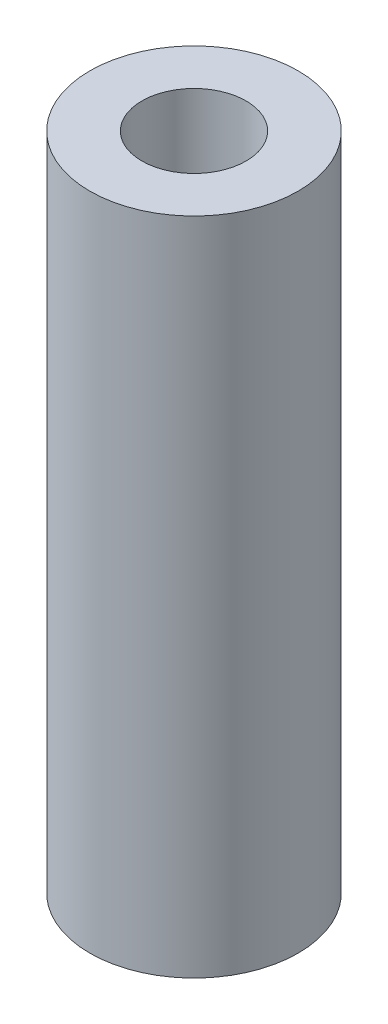
ISO-10303-21;
HEADER;
FILE_DESCRIPTION(('STEP AP214'),'2;1');
FILE_NAME('part.step','',(''),(''),'','','');
FILE_SCHEMA(('AUTOMOTIVE_DESIGN { 1 0 10303 214 1 1 1 1 }'));
ENDSEC;
DATA;
#1=APPLICATION_CONTEXT('core data for automotive mechanical design processes');
#2=APPLICATION_PROTOCOL_DEFINITION('international standard','automotive_design',2000,#1);
#3=PRODUCT_CONTEXT('',#1,'mechanical');
#4=PRODUCT('Part','Part','',(#3));
#5=PRODUCT_RELATED_PRODUCT_CATEGORY('part','',(#4));
#6=PRODUCT_DEFINITION_FORMATION('','',#4);
#7=PRODUCT_DEFINITION_CONTEXT('part definition',#1,'design');
#8=PRODUCT_DEFINITION('design','',#6,#7);
#9=PRODUCT_DEFINITION_SHAPE('','',#8);
#10=(LENGTH_UNIT() NAMED_UNIT(*) SI_UNIT(.MILLI.,.METRE.));
#11=(NAMED_UNIT(*) PLANE_ANGLE_UNIT() SI_UNIT($,.RADIAN.));
#12=(NAMED_UNIT(*) SI_UNIT($,.STERADIAN.) SOLID_ANGLE_UNIT());
#13=UNCERTAINTY_MEASURE_WITH_UNIT(LENGTH_MEASURE(1.E-05),#10,'distance_accuracy_value','');
#14=(GEOMETRIC_REPRESENTATION_CONTEXT(3) GLOBAL_UNCERTAINTY_ASSIGNED_CONTEXT((#13)) GLOBAL_UNIT_ASSIGNED_CONTEXT((#10,
#11,#12)) REPRESENTATION_CONTEXT('',''));
#15=CARTESIAN_POINT('',(0.,0.,0.));
#16=DIRECTION('',(0.,0.,1.));
#17=DIRECTION('',(1.,0.,0.));
#18=AXIS2_PLACEMENT_3D('',#15,#16,#17);
#19=CARTESIAN_POINT('',(0.,19.,0.));
#20=DIRECTION('',(0.,1.,0.));
#21=DIRECTION('',(0.,0.,1.));
#22=AXIS2_PLACEMENT_3D('',#19,#20,#21);
#23=PLANE('',#22);
#24=CARTESIAN_POINT('',(0.,19.,0.));
#25=DIRECTION('',(0.,1.,0.));
#26=DIRECTION('',(0.,0.,1.));
#27=AXIS2_PLACEMENT_3D('',#24,#25,#26);
#28=CIRCLE('',#27,3.);
#29=CARTESIAN_POINT('',(0.,19.,3.));
#30=VERTEX_POINT('',#29);
#31=EDGE_CURVE('E10',#30,#30,#28,.T.);
#32=ORIENTED_EDGE('',*,*,#31,.T.);
#33=EDGE_LOOP('',(#32));
#34=FACE_BOUND('',#33,.T.);
#35=CARTESIAN_POINT('',(0.,19.,0.));
#36=DIRECTION('',(0.,1.,0.));
#37=DIRECTION('',(0.,0.,1.));
#38=AXIS2_PLACEMENT_3D('',#35,#36,#37);
#39=CIRCLE('',#38,1.5);
#40=CARTESIAN_POINT('',(0.,19.,1.5));
#41=VERTEX_POINT('',#40);
#42=EDGE_CURVE('E53',#41,#41,#39,.T.);
#43=ORIENTED_EDGE('',*,*,#42,.F.);
#44=EDGE_LOOP('',(#43));
#45=FACE_BOUND('',#44,.T.);
#46=ADVANCED_FACE('F39',(#34,#45),#23,.T.);
#47=CARTESIAN_POINT('',(0.,0.,0.));
#48=DIRECTION('',(0.,1.,0.));
#49=DIRECTION('',(0.,0.,1.));
#50=AXIS2_PLACEMENT_3D('',#47,#48,#49);
#51=PLANE('',#50);
#52=CARTESIAN_POINT('',(0.,0.,0.));
#53=DIRECTION('',(0.,1.,0.));
#54=DIRECTION('',(0.,0.,1.));
#55=AXIS2_PLACEMENT_3D('',#52,#53,#54);
#56=CIRCLE('',#55,3.);
#57=CARTESIAN_POINT('',(0.,0.,3.));
#58=VERTEX_POINT('',#57);
#59=EDGE_CURVE('E43',#58,#58,#56,.T.);
#60=ORIENTED_EDGE('',*,*,#59,.F.);
#61=EDGE_LOOP('',(#60));
#62=FACE_BOUND('',#61,.T.);
#63=CARTESIAN_POINT('',(0.,0.,0.));
#64=DIRECTION('',(0.,1.,0.));
#65=DIRECTION('',(0.,0.,1.));
#66=AXIS2_PLACEMENT_3D('',#63,#64,#65);
#67=CIRCLE('',#66,1.5);
#68=CARTESIAN_POINT('',(0.,0.,1.5));
#69=VERTEX_POINT('',#68);
#70=EDGE_CURVE('E55',#69,#69,#67,.T.);
#71=ORIENTED_EDGE('',*,*,#70,.T.);
#72=EDGE_LOOP('',(#71));
#73=FACE_BOUND('',#72,.T.);
#74=ADVANCED_FACE('F68',(#62,#73),#51,.F.);
#75=CARTESIAN_POINT('',(0.,19.,0.));
#76=DIRECTION('',(0.,-1.,0.));
#77=DIRECTION('',(0.,0.,-1.));
#78=AXIS2_PLACEMENT_3D('',#75,#76,#77);
#79=CYLINDRICAL_SURFACE('',#78,3.);
#80=ORIENTED_EDGE('',*,*,#31,.F.);
#81=EDGE_LOOP('',(#80));
#82=FACE_BOUND('',#81,.T.);
#83=ORIENTED_EDGE('',*,*,#59,.T.);
#84=EDGE_LOOP('',(#83));
#85=FACE_BOUND('',#84,.T.);
#86=ADVANCED_FACE('F41',(#82,#85),#79,.T.);
#87=CARTESIAN_POINT('',(0.,19.,0.));
#88=DIRECTION('',(0.,-1.,0.));
#89=DIRECTION('',(0.,0.,-1.));
#90=AXIS2_PLACEMENT_3D('',#87,#88,#89);
#91=CYLINDRICAL_SURFACE('',#90,1.5);
#92=ORIENTED_EDGE('',*,*,#42,.T.);
#93=EDGE_LOOP('',(#92));
#94=FACE_BOUND('',#93,.T.);
#95=ORIENTED_EDGE('',*,*,#70,.F.);
#96=EDGE_LOOP('',(#95));
#97=FACE_BOUND('',#96,.T.);
#98=ADVANCED_FACE('F64',(#94,#97),#91,.F.);
#99=CLOSED_SHELL('',(#46,#74,#86,#98));
#100=MANIFOLD_SOLID_BREP('B2',#99);
#101=ADVANCED_BREP_SHAPE_REPRESENTATION('',(#18,#100),#14);
#102=SHAPE_DEFINITION_REPRESENTATION(#9,#101);
ENDSEC;
END-ISO-10303-21;
